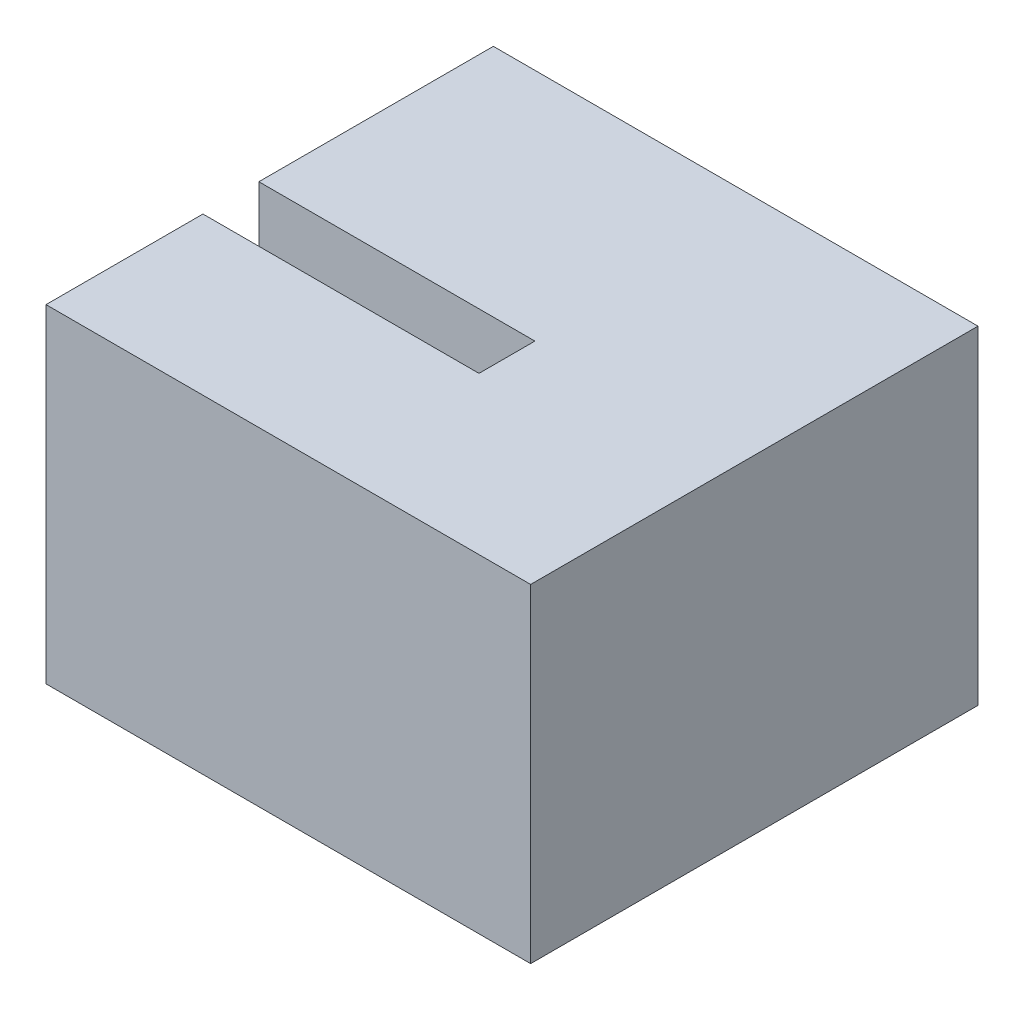
ISO-10303-21;
HEADER;
FILE_DESCRIPTION(('STEP AP214'),'2;1');
FILE_NAME('part.step','',(''),(''),'','','');
FILE_SCHEMA(('AUTOMOTIVE_DESIGN { 1 0 10303 214 1 1 1 1 }'));
ENDSEC;
DATA;
#1=APPLICATION_CONTEXT('core data for automotive mechanical design processes');
#2=APPLICATION_PROTOCOL_DEFINITION('international standard','automotive_design',2000,#1);
#3=PRODUCT_CONTEXT('',#1,'mechanical');
#4=PRODUCT('Part','Part','',(#3));
#5=PRODUCT_RELATED_PRODUCT_CATEGORY('part','',(#4));
#6=PRODUCT_DEFINITION_FORMATION('','',#4);
#7=PRODUCT_DEFINITION_CONTEXT('part definition',#1,'design');
#8=PRODUCT_DEFINITION('design','',#6,#7);
#9=PRODUCT_DEFINITION_SHAPE('','',#8);
#10=(LENGTH_UNIT() NAMED_UNIT(*) SI_UNIT(.MILLI.,.METRE.));
#11=(NAMED_UNIT(*) PLANE_ANGLE_UNIT() SI_UNIT($,.RADIAN.));
#12=(NAMED_UNIT(*) SI_UNIT($,.STERADIAN.) SOLID_ANGLE_UNIT());
#13=UNCERTAINTY_MEASURE_WITH_UNIT(LENGTH_MEASURE(1.E-05),#10,'distance_accuracy_value','');
#14=(GEOMETRIC_REPRESENTATION_CONTEXT(3) GLOBAL_UNCERTAINTY_ASSIGNED_CONTEXT((#13)) GLOBAL_UNIT_ASSIGNED_CONTEXT((#10,
#11,#12)) REPRESENTATION_CONTEXT('',''));
#15=CARTESIAN_POINT('',(0.,0.,0.));
#16=DIRECTION('',(0.,0.,1.));
#17=DIRECTION('',(1.,0.,0.));
#18=AXIS2_PLACEMENT_3D('',#15,#16,#17);
#19=CARTESIAN_POINT('',(14.6243255997116,-4.40499999999998,-8.6));
#20=DIRECTION('',(1.,0.,0.));
#21=DIRECTION('',(0.,0.,-1.));
#22=AXIS2_PLACEMENT_3D('',#19,#20,#21);
#23=PLANE('',#22);
#24=DIRECTION('',(0.,1.,0.));
#25=VECTOR('',#24,1.);
#26=CARTESIAN_POINT('',(14.6243255997116,-4.40499999999998,-9.35));
#27=LINE('',#26,#25);
#28=CARTESIAN_POINT('',(14.6243255997116,4.405,-9.35000000000002));
#29=VERTEX_POINT('',#28);
#30=CARTESIAN_POINT('',(14.6243255997116,-4.40499999999999,-9.35));
#31=VERTEX_POINT('',#30);
#32=EDGE_CURVE('E83',#29,#31,#27,.F.);
#33=ORIENTED_EDGE('',*,*,#32,.T.);
#34=DIRECTION('',(0.,0.,-1.));
#35=VECTOR('',#34,1.);
#36=CARTESIAN_POINT('',(14.6243255997116,-4.405,-3.64));
#37=LINE('',#36,#35);
#38=CARTESIAN_POINT('',(14.6243255997116,-4.40499999999999,-7.85000000000001));
#39=VERTEX_POINT('',#38);
#40=EDGE_CURVE('E80',#39,#31,#37,.T.);
#41=ORIENTED_EDGE('',*,*,#40,.F.);
#42=DIRECTION('',(0.,-1.,0.));
#43=VECTOR('',#42,1.);
#44=CARTESIAN_POINT('',(14.6243255997116,-4.40499999999998,-7.85));
#45=LINE('',#44,#43);
#46=CARTESIAN_POINT('',(14.6243255997116,4.405,-7.85000000000003));
#47=VERTEX_POINT('',#46);
#48=EDGE_CURVE('E101',#39,#47,#45,.F.);
#49=ORIENTED_EDGE('',*,*,#48,.T.);
#50=DIRECTION('',(0.,0.,-1.));
#51=VECTOR('',#50,1.);
#52=CARTESIAN_POINT('',(14.6243255997116,4.405,-8.6));
#53=LINE('',#52,#51);
#54=EDGE_CURVE('E20',#29,#47,#53,.F.);
#55=ORIENTED_EDGE('',*,*,#54,.F.);
#56=EDGE_LOOP('',(#33,#41,#49,#55));
#57=FACE_BOUND('',#56,.T.);
#58=ADVANCED_FACE('F17',(#57),#23,.F.);
#59=CARTESIAN_POINT('',(13.72,-4.405,-3.64));
#60=DIRECTION('',(0.,-1.,0.));
#61=DIRECTION('',(0.,0.,-1.));
#62=AXIS2_PLACEMENT_3D('',#59,#60,#61);
#63=PLANE('',#62);
#64=DIRECTION('',(1.,0.,0.));
#65=VECTOR('',#64,1.);
#66=CARTESIAN_POINT('',(9.67216279985582,-4.40499999999998,-7.85));
#67=LINE('',#66,#65);
#68=CARTESIAN_POINT('',(7.22,-4.40499999999999,-7.85000000000001));
#69=VERTEX_POINT('',#68);
#70=EDGE_CURVE('E94',#69,#39,#67,.T.);
#71=ORIENTED_EDGE('',*,*,#70,.T.);
#72=ORIENTED_EDGE('',*,*,#40,.T.);
#73=DIRECTION('',(1.,0.,0.));
#74=VECTOR('',#73,1.);
#75=CARTESIAN_POINT('',(9.67216279985582,-4.40499999999998,-9.35));
#76=LINE('',#75,#74);
#77=CARTESIAN_POINT('',(7.22,-4.40499999999999,-9.35));
#78=VERTEX_POINT('',#77);
#79=EDGE_CURVE('E87',#31,#78,#76,.F.);
#80=ORIENTED_EDGE('',*,*,#79,.T.);
#81=DIRECTION('',(0.,0.,1.));
#82=VECTOR('',#81,1.);
#83=CARTESIAN_POINT('',(7.22,-4.405,-3.64));
#84=LINE('',#83,#82);
#85=CARTESIAN_POINT('',(7.22,-4.405,-15.64));
#86=VERTEX_POINT('',#85);
#87=EDGE_CURVE('E127',#86,#78,#84,.T.);
#88=ORIENTED_EDGE('',*,*,#87,.F.);
#89=DIRECTION('',(1.,0.,0.));
#90=VECTOR('',#89,1.);
#91=CARTESIAN_POINT('',(13.72,-4.405,-15.64));
#92=LINE('',#91,#90);
#93=CARTESIAN_POINT('',(20.22,-4.405,-15.64));
#94=VERTEX_POINT('',#93);
#95=EDGE_CURVE('E123',#94,#86,#92,.F.);
#96=ORIENTED_EDGE('',*,*,#95,.F.);
#97=DIRECTION('',(0.,0.,-1.));
#98=VECTOR('',#97,1.);
#99=CARTESIAN_POINT('',(20.22,-4.405,-3.64));
#100=LINE('',#99,#98);
#101=CARTESIAN_POINT('',(20.22,-4.405,-3.64));
#102=VERTEX_POINT('',#101);
#103=EDGE_CURVE('E118',#102,#94,#100,.T.);
#104=ORIENTED_EDGE('',*,*,#103,.F.);
#105=DIRECTION('',(1.,0.,0.));
#106=VECTOR('',#105,1.);
#107=CARTESIAN_POINT('',(13.72,-4.405,-3.64));
#108=LINE('',#107,#106);
#109=CARTESIAN_POINT('',(7.22,-4.405,-3.64));
#110=VERTEX_POINT('',#109);
#111=EDGE_CURVE('E111',#102,#110,#108,.F.);
#112=ORIENTED_EDGE('',*,*,#111,.T.);
#113=DIRECTION('',(0.,0.,1.));
#114=VECTOR('',#113,1.);
#115=CARTESIAN_POINT('',(7.22,-4.40499999999998,-3.64));
#116=LINE('',#115,#114);
#117=EDGE_CURVE('E108',#69,#110,#116,.T.);
#118=ORIENTED_EDGE('',*,*,#117,.F.);
#119=EDGE_LOOP('',(#71,#72,#80,#88,#96,#104,#112,#118));
#120=FACE_BOUND('',#119,.T.);
#121=ADVANCED_FACE('F90',(#120),#63,.T.);
#122=CARTESIAN_POINT('',(9.67216279985582,-4.40499999999998,-9.35));
#123=DIRECTION('',(0.,0.,-1.));
#124=DIRECTION('',(0.,1.,0.));
#125=AXIS2_PLACEMENT_3D('',#122,#123,#124);
#126=PLANE('',#125);
#127=DIRECTION('',(0.,1.,0.));
#128=VECTOR('',#127,1.);
#129=CARTESIAN_POINT('',(7.22,0.,-9.35));
#130=LINE('',#129,#128);
#131=CARTESIAN_POINT('',(7.22,4.405,-9.35000000000002));
#132=VERTEX_POINT('',#131);
#133=EDGE_CURVE('E98',#78,#132,#130,.T.);
#134=ORIENTED_EDGE('',*,*,#133,.F.);
#135=ORIENTED_EDGE('',*,*,#79,.F.);
#136=ORIENTED_EDGE('',*,*,#32,.F.);
#137=DIRECTION('',(1.,0.,0.));
#138=VECTOR('',#137,1.);
#139=CARTESIAN_POINT('',(13.72,4.405,-9.35000000000003));
#140=LINE('',#139,#138);
#141=EDGE_CURVE('E129',#132,#29,#140,.T.);
#142=ORIENTED_EDGE('',*,*,#141,.F.);
#143=EDGE_LOOP('',(#134,#135,#136,#142));
#144=FACE_BOUND('',#143,.T.);
#145=ADVANCED_FACE('F96',(#144),#126,.F.);
#146=CARTESIAN_POINT('',(9.67216279985582,-4.40499999999998,-7.85));
#147=DIRECTION('',(0.,0.,1.));
#148=DIRECTION('',(0.,-1.,0.));
#149=AXIS2_PLACEMENT_3D('',#146,#147,#148);
#150=PLANE('',#149);
#151=ORIENTED_EDGE('',*,*,#48,.F.);
#152=ORIENTED_EDGE('',*,*,#70,.F.);
#153=DIRECTION('',(0.,1.,0.));
#154=VECTOR('',#153,1.);
#155=CARTESIAN_POINT('',(7.22,0.,-7.85000000000003));
#156=LINE('',#155,#154);
#157=CARTESIAN_POINT('',(7.22,4.405,-7.85000000000003));
#158=VERTEX_POINT('',#157);
#159=EDGE_CURVE('E105',#158,#69,#156,.F.);
#160=ORIENTED_EDGE('',*,*,#159,.F.);
#161=DIRECTION('',(1.,0.,0.));
#162=VECTOR('',#161,1.);
#163=CARTESIAN_POINT('',(13.72,4.405,-7.85000000000003));
#164=LINE('',#163,#162);
#165=EDGE_CURVE('E131',#47,#158,#164,.F.);
#166=ORIENTED_EDGE('',*,*,#165,.F.);
#167=EDGE_LOOP('',(#151,#152,#160,#166));
#168=FACE_BOUND('',#167,.T.);
#169=ADVANCED_FACE('F173',(#168),#150,.F.);
#170=CARTESIAN_POINT('',(7.22,0.,-3.64));
#171=DIRECTION('',(-1.,0.,0.));
#172=DIRECTION('',(0.,0.,1.));
#173=AXIS2_PLACEMENT_3D('',#170,#171,#172);
#174=PLANE('',#173);
#175=DIRECTION('',(0.,1.,0.));
#176=VECTOR('',#175,1.);
#177=CARTESIAN_POINT('',(7.22,0.,-3.64));
#178=LINE('',#177,#176);
#179=CARTESIAN_POINT('',(7.22,4.405,-3.64));
#180=VERTEX_POINT('',#179);
#181=EDGE_CURVE('E113',#110,#180,#178,.T.);
#182=ORIENTED_EDGE('',*,*,#181,.T.);
#183=DIRECTION('',(0.,0.,1.));
#184=VECTOR('',#183,1.);
#185=CARTESIAN_POINT('',(7.22,4.405,-3.64));
#186=LINE('',#185,#184);
#187=EDGE_CURVE('E134',#158,#180,#186,.T.);
#188=ORIENTED_EDGE('',*,*,#187,.F.);
#189=ORIENTED_EDGE('',*,*,#159,.T.);
#190=ORIENTED_EDGE('',*,*,#117,.T.);
#191=EDGE_LOOP('',(#182,#188,#189,#190));
#192=FACE_BOUND('',#191,.T.);
#193=ADVANCED_FACE('F169',(#192),#174,.T.);
#194=CARTESIAN_POINT('',(13.72,0.,-3.64));
#195=DIRECTION('',(0.,0.,-1.));
#196=DIRECTION('',(0.,1.,0.));
#197=AXIS2_PLACEMENT_3D('',#194,#195,#196);
#198=PLANE('',#197);
#199=ORIENTED_EDGE('',*,*,#181,.F.);
#200=ORIENTED_EDGE('',*,*,#111,.F.);
#201=DIRECTION('',(0.,1.,0.));
#202=VECTOR('',#201,1.);
#203=CARTESIAN_POINT('',(20.22,0.,-3.64));
#204=LINE('',#203,#202);
#205=CARTESIAN_POINT('',(20.22,4.405,-3.64));
#206=VERTEX_POINT('',#205);
#207=EDGE_CURVE('E115',#206,#102,#204,.F.);
#208=ORIENTED_EDGE('',*,*,#207,.F.);
#209=DIRECTION('',(1.,0.,0.));
#210=VECTOR('',#209,1.);
#211=CARTESIAN_POINT('',(13.72,4.405,-3.64));
#212=LINE('',#211,#210);
#213=EDGE_CURVE('E137',#180,#206,#212,.T.);
#214=ORIENTED_EDGE('',*,*,#213,.F.);
#215=EDGE_LOOP('',(#199,#200,#208,#214));
#216=FACE_BOUND('',#215,.T.);
#217=ADVANCED_FACE('F166',(#216),#198,.F.);
#218=CARTESIAN_POINT('',(20.22,0.,-3.64));
#219=DIRECTION('',(1.,0.,0.));
#220=DIRECTION('',(0.,0.,-1.));
#221=AXIS2_PLACEMENT_3D('',#218,#219,#220);
#222=PLANE('',#221);
#223=ORIENTED_EDGE('',*,*,#207,.T.);
#224=ORIENTED_EDGE('',*,*,#103,.T.);
#225=DIRECTION('',(0.,1.,0.));
#226=VECTOR('',#225,1.);
#227=CARTESIAN_POINT('',(20.22,0.,-15.64));
#228=LINE('',#227,#226);
#229=CARTESIAN_POINT('',(20.22,4.405,-15.64));
#230=VERTEX_POINT('',#229);
#231=EDGE_CURVE('E120',#230,#94,#228,.F.);
#232=ORIENTED_EDGE('',*,*,#231,.F.);
#233=DIRECTION('',(0.,0.,1.));
#234=VECTOR('',#233,1.);
#235=CARTESIAN_POINT('',(20.22,4.405,-3.64));
#236=LINE('',#235,#234);
#237=EDGE_CURVE('E140',#206,#230,#236,.F.);
#238=ORIENTED_EDGE('',*,*,#237,.F.);
#239=EDGE_LOOP('',(#223,#224,#232,#238));
#240=FACE_BOUND('',#239,.T.);
#241=ADVANCED_FACE('F150',(#240),#222,.T.);
#242=CARTESIAN_POINT('',(13.72,0.,-15.64));
#243=DIRECTION('',(0.,0.,-1.));
#244=DIRECTION('',(0.,1.,0.));
#245=AXIS2_PLACEMENT_3D('',#242,#243,#244);
#246=PLANE('',#245);
#247=ORIENTED_EDGE('',*,*,#231,.T.);
#248=ORIENTED_EDGE('',*,*,#95,.T.);
#249=DIRECTION('',(0.,1.,0.));
#250=VECTOR('',#249,1.);
#251=CARTESIAN_POINT('',(7.22,0.,-15.64));
#252=LINE('',#251,#250);
#253=CARTESIAN_POINT('',(7.22,4.405,-15.64));
#254=VERTEX_POINT('',#253);
#255=EDGE_CURVE('E35',#254,#86,#252,.F.);
#256=ORIENTED_EDGE('',*,*,#255,.F.);
#257=DIRECTION('',(1.,0.,0.));
#258=VECTOR('',#257,1.);
#259=CARTESIAN_POINT('',(13.72,4.405,-15.64));
#260=LINE('',#259,#258);
#261=EDGE_CURVE('E26',#230,#254,#260,.F.);
#262=ORIENTED_EDGE('',*,*,#261,.F.);
#263=EDGE_LOOP('',(#247,#248,#256,#262));
#264=FACE_BOUND('',#263,.T.);
#265=ADVANCED_FACE('F147',(#264),#246,.T.);
#266=CARTESIAN_POINT('',(7.22,0.,-3.64));
#267=DIRECTION('',(-1.,0.,0.));
#268=DIRECTION('',(0.,0.,1.));
#269=AXIS2_PLACEMENT_3D('',#266,#267,#268);
#270=PLANE('',#269);
#271=ORIENTED_EDGE('',*,*,#255,.T.);
#272=ORIENTED_EDGE('',*,*,#87,.T.);
#273=ORIENTED_EDGE('',*,*,#133,.T.);
#274=DIRECTION('',(0.,0.,1.));
#275=VECTOR('',#274,1.);
#276=CARTESIAN_POINT('',(7.22,4.405,-3.64));
#277=LINE('',#276,#275);
#278=EDGE_CURVE('E11',#254,#132,#277,.T.);
#279=ORIENTED_EDGE('',*,*,#278,.F.);
#280=EDGE_LOOP('',(#271,#272,#273,#279));
#281=FACE_BOUND('',#280,.T.);
#282=ADVANCED_FACE('F153',(#281),#270,.T.);
#283=CARTESIAN_POINT('',(13.72,4.405,-3.64));
#284=DIRECTION('',(0.,1.,0.));
#285=DIRECTION('',(0.,0.,1.));
#286=AXIS2_PLACEMENT_3D('',#283,#284,#285);
#287=PLANE('',#286);
#288=ORIENTED_EDGE('',*,*,#261,.T.);
#289=ORIENTED_EDGE('',*,*,#278,.T.);
#290=ORIENTED_EDGE('',*,*,#141,.T.);
#291=ORIENTED_EDGE('',*,*,#54,.T.);
#292=ORIENTED_EDGE('',*,*,#165,.T.);
#293=ORIENTED_EDGE('',*,*,#187,.T.);
#294=ORIENTED_EDGE('',*,*,#213,.T.);
#295=ORIENTED_EDGE('',*,*,#237,.T.);
#296=EDGE_LOOP('',(#288,#289,#290,#291,#292,#293,#294,#295));
#297=FACE_BOUND('',#296,.T.);
#298=ADVANCED_FACE('F145',(#297),#287,.T.);
#299=CLOSED_SHELL('',(#58,#121,#145,#169,#193,#217,#241,#265,#282,#298));
#300=MANIFOLD_SOLID_BREP('B1',#299);
#301=ADVANCED_BREP_SHAPE_REPRESENTATION('',(#18,#300),#14);
#302=SHAPE_DEFINITION_REPRESENTATION(#9,#301);
ENDSEC;
END-ISO-10303-21;
